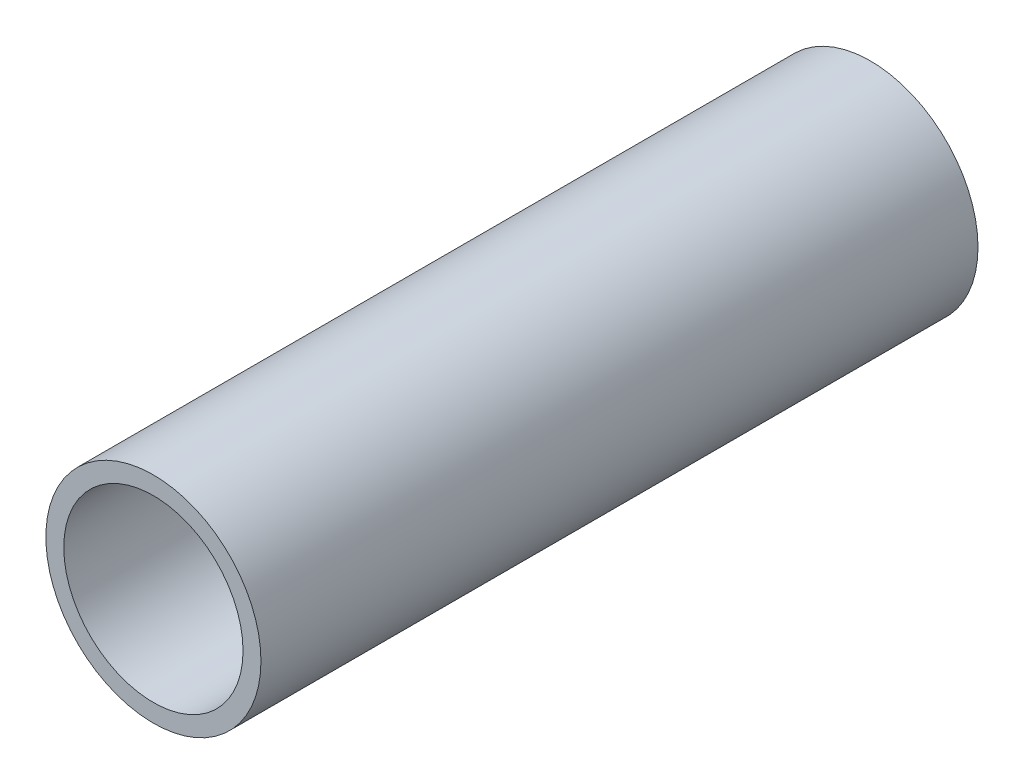
ISO-10303-21;
HEADER;
FILE_DESCRIPTION(('STEP AP214'),'2;1');
FILE_NAME('part.step','',(''),(''),'','','');
FILE_SCHEMA(('AUTOMOTIVE_DESIGN { 1 0 10303 214 1 1 1 1 }'));
ENDSEC;
DATA;
#1=APPLICATION_CONTEXT('core data for automotive mechanical design processes');
#2=APPLICATION_PROTOCOL_DEFINITION('international standard','automotive_design',2000,#1);
#3=PRODUCT_CONTEXT('',#1,'mechanical');
#4=PRODUCT('Part','Part','',(#3));
#5=PRODUCT_RELATED_PRODUCT_CATEGORY('part','',(#4));
#6=PRODUCT_DEFINITION_FORMATION('','',#4);
#7=PRODUCT_DEFINITION_CONTEXT('part definition',#1,'design');
#8=PRODUCT_DEFINITION('design','',#6,#7);
#9=PRODUCT_DEFINITION_SHAPE('','',#8);
#10=(LENGTH_UNIT() NAMED_UNIT(*) SI_UNIT(.MILLI.,.METRE.));
#11=(NAMED_UNIT(*) PLANE_ANGLE_UNIT() SI_UNIT($,.RADIAN.));
#12=(NAMED_UNIT(*) SI_UNIT($,.STERADIAN.) SOLID_ANGLE_UNIT());
#13=UNCERTAINTY_MEASURE_WITH_UNIT(LENGTH_MEASURE(1.E-05),#10,'distance_accuracy_value','');
#14=(GEOMETRIC_REPRESENTATION_CONTEXT(3) GLOBAL_UNCERTAINTY_ASSIGNED_CONTEXT((#13)) GLOBAL_UNIT_ASSIGNED_CONTEXT((#10,
#11,#12)) REPRESENTATION_CONTEXT('',''));
#15=CARTESIAN_POINT('',(0.,0.,0.));
#16=DIRECTION('',(0.,0.,1.));
#17=DIRECTION('',(1.,0.,0.));
#18=AXIS2_PLACEMENT_3D('',#15,#16,#17);
#19=CARTESIAN_POINT('',(0.,0.,40.));
#20=DIRECTION('',(0.,0.,1.));
#21=DIRECTION('',(1.,0.,0.));
#22=AXIS2_PLACEMENT_3D('',#19,#20,#21);
#23=PLANE('',#22);
#24=CARTESIAN_POINT('',(0.,0.,40.));
#25=DIRECTION('',(0.,0.,1.));
#26=DIRECTION('',(1.,0.,0.));
#27=AXIS2_PLACEMENT_3D('',#24,#25,#26);
#28=CIRCLE('',#27,6.);
#29=CARTESIAN_POINT('',(6.,0.,40.));
#30=VERTEX_POINT('',#29);
#31=EDGE_CURVE('E10',#30,#30,#28,.T.);
#32=ORIENTED_EDGE('',*,*,#31,.T.);
#33=EDGE_LOOP('',(#32));
#34=FACE_BOUND('',#33,.T.);
#35=CARTESIAN_POINT('',(0.,0.,40.));
#36=DIRECTION('',(0.,0.,1.));
#37=DIRECTION('',(1.,0.,0.));
#38=AXIS2_PLACEMENT_3D('',#35,#36,#37);
#39=CIRCLE('',#38,5.);
#40=CARTESIAN_POINT('',(5.,0.,40.));
#41=VERTEX_POINT('',#40);
#42=EDGE_CURVE('E50',#41,#41,#39,.T.);
#43=ORIENTED_EDGE('',*,*,#42,.F.);
#44=EDGE_LOOP('',(#43));
#45=FACE_BOUND('',#44,.T.);
#46=ADVANCED_FACE('F37',(#34,#45),#23,.T.);
#47=CARTESIAN_POINT('',(0.,0.,0.));
#48=DIRECTION('',(0.,0.,1.));
#49=DIRECTION('',(1.,0.,0.));
#50=AXIS2_PLACEMENT_3D('',#47,#48,#49);
#51=PLANE('',#50);
#52=CARTESIAN_POINT('',(0.,0.,0.));
#53=DIRECTION('',(0.,0.,1.));
#54=DIRECTION('',(1.,0.,0.));
#55=AXIS2_PLACEMENT_3D('',#52,#53,#54);
#56=CIRCLE('',#55,6.);
#57=CARTESIAN_POINT('',(6.,0.,0.));
#58=VERTEX_POINT('',#57);
#59=EDGE_CURVE('E41',#58,#58,#56,.T.);
#60=ORIENTED_EDGE('',*,*,#59,.F.);
#61=EDGE_LOOP('',(#60));
#62=FACE_BOUND('',#61,.T.);
#63=CARTESIAN_POINT('',(0.,0.,0.));
#64=DIRECTION('',(0.,0.,1.));
#65=DIRECTION('',(1.,0.,0.));
#66=AXIS2_PLACEMENT_3D('',#63,#64,#65);
#67=CIRCLE('',#66,5.);
#68=CARTESIAN_POINT('',(5.,0.,0.));
#69=VERTEX_POINT('',#68);
#70=EDGE_CURVE('E52',#69,#69,#67,.T.);
#71=ORIENTED_EDGE('',*,*,#70,.T.);
#72=EDGE_LOOP('',(#71));
#73=FACE_BOUND('',#72,.T.);
#74=ADVANCED_FACE('F64',(#62,#73),#51,.F.);
#75=CARTESIAN_POINT('',(0.,0.,40.));
#76=DIRECTION('',(0.,0.,-1.));
#77=DIRECTION('',(-1.,0.,0.));
#78=AXIS2_PLACEMENT_3D('',#75,#76,#77);
#79=CYLINDRICAL_SURFACE('',#78,6.);
#80=ORIENTED_EDGE('',*,*,#31,.F.);
#81=EDGE_LOOP('',(#80));
#82=FACE_BOUND('',#81,.T.);
#83=ORIENTED_EDGE('',*,*,#59,.T.);
#84=EDGE_LOOP('',(#83));
#85=FACE_BOUND('',#84,.T.);
#86=ADVANCED_FACE('F39',(#82,#85),#79,.T.);
#87=CARTESIAN_POINT('',(0.,0.,40.));
#88=DIRECTION('',(0.,0.,-1.));
#89=DIRECTION('',(-1.,0.,0.));
#90=AXIS2_PLACEMENT_3D('',#87,#88,#89);
#91=CYLINDRICAL_SURFACE('',#90,5.);
#92=ORIENTED_EDGE('',*,*,#42,.T.);
#93=EDGE_LOOP('',(#92));
#94=FACE_BOUND('',#93,.T.);
#95=ORIENTED_EDGE('',*,*,#70,.F.);
#96=EDGE_LOOP('',(#95));
#97=FACE_BOUND('',#96,.T.);
#98=ADVANCED_FACE('F60',(#94,#97),#91,.F.);
#99=CLOSED_SHELL('',(#46,#74,#86,#98));
#100=MANIFOLD_SOLID_BREP('B2',#99);
#101=ADVANCED_BREP_SHAPE_REPRESENTATION('',(#18,#100),#14);
#102=SHAPE_DEFINITION_REPRESENTATION(#9,#101);
ENDSEC;
END-ISO-10303-21;
